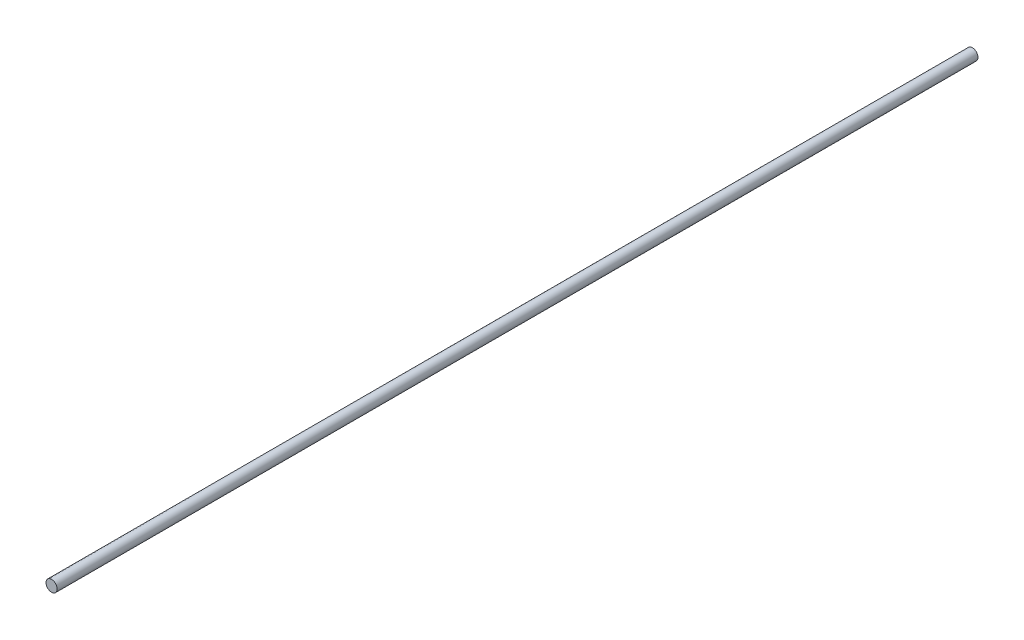
ISO-10303-21;
HEADER;
FILE_DESCRIPTION(('STEP AP214'),'2;1');
FILE_NAME('part.step','',(''),(''),'','','');
FILE_SCHEMA(('AUTOMOTIVE_DESIGN { 1 0 10303 214 1 1 1 1 }'));
ENDSEC;
DATA;
#1=APPLICATION_CONTEXT('core data for automotive mechanical design processes');
#2=APPLICATION_PROTOCOL_DEFINITION('international standard','automotive_design',2000,#1);
#3=PRODUCT_CONTEXT('',#1,'mechanical');
#4=PRODUCT('Part','Part','',(#3));
#5=PRODUCT_RELATED_PRODUCT_CATEGORY('part','',(#4));
#6=PRODUCT_DEFINITION_FORMATION('','',#4);
#7=PRODUCT_DEFINITION_CONTEXT('part definition',#1,'design');
#8=PRODUCT_DEFINITION('design','',#6,#7);
#9=PRODUCT_DEFINITION_SHAPE('','',#8);
#10=(LENGTH_UNIT() NAMED_UNIT(*) SI_UNIT(.MILLI.,.METRE.));
#11=(NAMED_UNIT(*) PLANE_ANGLE_UNIT() SI_UNIT($,.RADIAN.));
#12=(NAMED_UNIT(*) SI_UNIT($,.STERADIAN.) SOLID_ANGLE_UNIT());
#13=UNCERTAINTY_MEASURE_WITH_UNIT(LENGTH_MEASURE(1.E-05),#10,'distance_accuracy_value','');
#14=(GEOMETRIC_REPRESENTATION_CONTEXT(3) GLOBAL_UNCERTAINTY_ASSIGNED_CONTEXT((#13)) GLOBAL_UNIT_ASSIGNED_CONTEXT((#10,
#11,#12)) REPRESENTATION_CONTEXT('',''));
#15=CARTESIAN_POINT('',(0.,0.,0.));
#16=DIRECTION('',(0.,0.,1.));
#17=DIRECTION('',(1.,0.,0.));
#18=AXIS2_PLACEMENT_3D('',#15,#16,#17);
#19=CARTESIAN_POINT('',(0.,0.,-784.225));
#20=DIRECTION('',(0.,0.,1.));
#21=DIRECTION('',(1.,0.,0.));
#22=AXIS2_PLACEMENT_3D('',#19,#20,#21);
#23=CYLINDRICAL_SURFACE('',#22,4.7625);
#24=CARTESIAN_POINT('',(0.,0.,-784.225));
#25=DIRECTION('',(0.,0.,1.));
#26=DIRECTION('',(1.,0.,0.));
#27=AXIS2_PLACEMENT_3D('',#24,#25,#26);
#28=CIRCLE('',#27,4.7625);
#29=CARTESIAN_POINT('',(4.7625,0.,-784.225));
#30=VERTEX_POINT('',#29);
#31=EDGE_CURVE('E10',#30,#30,#28,.T.);
#32=CARTESIAN_POINT('',(0.,0.,0.));
#33=DIRECTION('',(0.,0.,1.));
#34=DIRECTION('',(1.,0.,0.));
#35=AXIS2_PLACEMENT_3D('',#32,#33,#34);
#36=CIRCLE('',#35,4.7625);
#37=CARTESIAN_POINT('',(4.7625,0.,-1.11022302462516E-13));
#38=VERTEX_POINT('',#37);
#39=EDGE_CURVE('E36',#38,#38,#36,.T.);
#40=CARTESIAN_POINT('',(4.7625,0.,-784.225));
#41=CARTESIAN_POINT('',(4.7625,0.,-776.055989583333));
#42=CARTESIAN_POINT('',(4.7625,0.,-767.886979166667));
#43=CARTESIAN_POINT('',(4.7625,0.,-751.548958333333));
#44=CARTESIAN_POINT('',(4.7625,0.,-743.379947916667));
#45=CARTESIAN_POINT('',(4.7625,0.,-727.041927083333));
#46=CARTESIAN_POINT('',(4.7625,0.,-718.872916666667));
#47=CARTESIAN_POINT('',(4.7625,0.,-702.534895833333));
#48=CARTESIAN_POINT('',(4.7625,0.,-694.365885416667));
#49=CARTESIAN_POINT('',(4.7625,0.,-678.027864583333));
#50=CARTESIAN_POINT('',(4.7625,0.,-669.858854166667));
#51=CARTESIAN_POINT('',(4.7625,0.,-653.520833333333));
#52=CARTESIAN_POINT('',(4.7625,0.,-645.351822916667));
#53=CARTESIAN_POINT('',(4.7625,0.,-629.013802083333));
#54=CARTESIAN_POINT('',(4.7625,0.,-620.844791666667));
#55=CARTESIAN_POINT('',(4.7625,0.,-604.506770833333));
#56=CARTESIAN_POINT('',(4.7625,0.,-596.337760416667));
#57=CARTESIAN_POINT('',(4.7625,0.,-579.999739583333));
#58=CARTESIAN_POINT('',(4.7625,0.,-571.830729166667));
#59=CARTESIAN_POINT('',(4.7625,0.,-555.492708333333));
#60=CARTESIAN_POINT('',(4.7625,0.,-547.323697916667));
#61=CARTESIAN_POINT('',(4.7625,0.,-530.985677083333));
#62=CARTESIAN_POINT('',(4.7625,0.,-522.816666666667));
#63=CARTESIAN_POINT('',(4.7625,0.,-506.478645833333));
#64=CARTESIAN_POINT('',(4.7625,0.,-498.309635416667));
#65=CARTESIAN_POINT('',(4.7625,0.,-481.971614583333));
#66=CARTESIAN_POINT('',(4.7625,0.,-473.802604166667));
#67=CARTESIAN_POINT('',(4.7625,0.,-457.464583333333));
#68=CARTESIAN_POINT('',(4.7625,0.,-449.295572916667));
#69=CARTESIAN_POINT('',(4.7625,0.,-432.957552083333));
#70=CARTESIAN_POINT('',(4.7625,0.,-424.788541666667));
#71=CARTESIAN_POINT('',(4.7625,0.,-408.450520833333));
#72=CARTESIAN_POINT('',(4.7625,0.,-400.281510416667));
#73=CARTESIAN_POINT('',(4.7625,0.,-383.943489583333));
#74=CARTESIAN_POINT('',(4.7625,0.,-375.774479166667));
#75=CARTESIAN_POINT('',(4.7625,0.,-359.436458333333));
#76=CARTESIAN_POINT('',(4.7625,0.,-351.267447916667));
#77=CARTESIAN_POINT('',(4.7625,0.,-334.929427083333));
#78=CARTESIAN_POINT('',(4.7625,0.,-326.760416666667));
#79=CARTESIAN_POINT('',(4.7625,0.,-310.422395833333));
#80=CARTESIAN_POINT('',(4.7625,0.,-302.253385416667));
#81=CARTESIAN_POINT('',(4.7625,0.,-285.915364583333));
#82=CARTESIAN_POINT('',(4.7625,0.,-277.746354166667));
#83=CARTESIAN_POINT('',(4.7625,0.,-261.408333333333));
#84=CARTESIAN_POINT('',(4.7625,0.,-253.239322916667));
#85=CARTESIAN_POINT('',(4.7625,0.,-236.901302083333));
#86=CARTESIAN_POINT('',(4.7625,0.,-228.732291666667));
#87=CARTESIAN_POINT('',(4.7625,0.,-212.394270833333));
#88=CARTESIAN_POINT('',(4.7625,0.,-204.225260416667));
#89=CARTESIAN_POINT('',(4.7625,0.,-187.887239583333));
#90=CARTESIAN_POINT('',(4.7625,0.,-179.718229166667));
#91=CARTESIAN_POINT('',(4.7625,0.,-163.380208333333));
#92=CARTESIAN_POINT('',(4.7625,0.,-155.211197916667));
#93=CARTESIAN_POINT('',(4.7625,0.,-138.873177083333));
#94=CARTESIAN_POINT('',(4.7625,0.,-130.704166666667));
#95=CARTESIAN_POINT('',(4.7625,0.,-114.366145833333));
#96=CARTESIAN_POINT('',(4.7625,0.,-106.197135416667));
#97=CARTESIAN_POINT('',(4.7625,0.,-89.8591145833335));
#98=CARTESIAN_POINT('',(4.7625,0.,-81.6901041666668));
#99=CARTESIAN_POINT('',(4.7625,0.,-65.3520833333335));
#100=CARTESIAN_POINT('',(4.7625,0.,-57.1830729166668));
#101=CARTESIAN_POINT('',(4.7625,0.,-40.8450520833334));
#102=CARTESIAN_POINT('',(4.7625,0.,-32.6760416666667));
#103=CARTESIAN_POINT('',(4.7625,0.,-16.3380208333334));
#104=CARTESIAN_POINT('',(4.7625,0.,-8.16901041666677));
#105=CARTESIAN_POINT('',(4.7625,0.,-1.11022302462516E-13));
#106=B_SPLINE_CURVE_WITH_KNOTS('',3,(#40,#41,#42,#43,#44,#45,#46,#47,#48,#49,#50,#51,#52,#53,
#54,#55,#56,#57,#58,#59,#60,#61,#62,#63,#64,#65,#66,#67,#68,#69,#70,#71,#72,#73,#74,#75,#76,#77,
#78,#79,#80,#81,#82,#83,#84,#85,#86,#87,#88,#89,#90,#91,#92,#93,#94,#95,#96,#97,#98,#99,#100,
#101,#102,#103,#104,#105),.UNSPECIFIED.,.F.,.F.,(4,2,2,2,2,2,2,2,2,2,2,2,2,2,2,2,2,2,2,2,2,2,2,
2,2,2,2,2,2,2,2,2,4),(0.,24.50703125,49.0140625,73.5210937499999,98.0281249999999,122.53515625,
147.0421875,171.54921875,196.05625,220.56328125,245.0703125,269.57734375,294.084375,
318.59140625,343.0984375,367.60546875,392.1125,416.61953125,441.1265625,465.63359375,490.140625,
514.64765625,539.1546875,563.66171875,588.16875,612.67578125,637.1828125,661.68984375,
686.196875,710.70390625,735.2109375,759.71796875,784.225),.UNSPECIFIED.);
#107=EDGE_CURVE('BSEAM33',#30,#38,#106,.T.);
#108=ORIENTED_EDGE('',*,*,#31,.T.);
#109=ORIENTED_EDGE('',*,*,#39,.F.);
#110=ORIENTED_EDGE('',*,*,#107,.T.);
#111=ORIENTED_EDGE('',*,*,#107,.F.);
#112=EDGE_LOOP('',(#108,#110,#109,#111));
#113=FACE_BOUND('',#112,.T.);
#114=ADVANCED_FACE('F33',(#113),#23,.T.);
#115=CARTESIAN_POINT('',(0.,0.,-784.225));
#116=DIRECTION('',(0.,0.,1.));
#117=DIRECTION('',(1.,0.,0.));
#118=AXIS2_PLACEMENT_3D('',#115,#116,#117);
#119=PLANE('',#118);
#120=ORIENTED_EDGE('',*,*,#31,.F.);
#121=EDGE_LOOP('',(#120));
#122=FACE_BOUND('',#121,.T.);
#123=ADVANCED_FACE('F48',(#122),#119,.F.);
#124=CARTESIAN_POINT('',(0.,0.,0.));
#125=DIRECTION('',(0.,0.,1.));
#126=DIRECTION('',(1.,0.,0.));
#127=AXIS2_PLACEMENT_3D('',#124,#125,#126);
#128=PLANE('',#127);
#129=ORIENTED_EDGE('',*,*,#39,.T.);
#130=EDGE_LOOP('',(#129));
#131=FACE_BOUND('',#130,.T.);
#132=ADVANCED_FACE('F45',(#131),#128,.T.);
#133=CLOSED_SHELL('',(#114,#123,#132));
#134=MANIFOLD_SOLID_BREP('B2',#133);
#135=ADVANCED_BREP_SHAPE_REPRESENTATION('',(#18,#134),#14);
#136=SHAPE_DEFINITION_REPRESENTATION(#9,#135);
ENDSEC;
END-ISO-10303-21;
